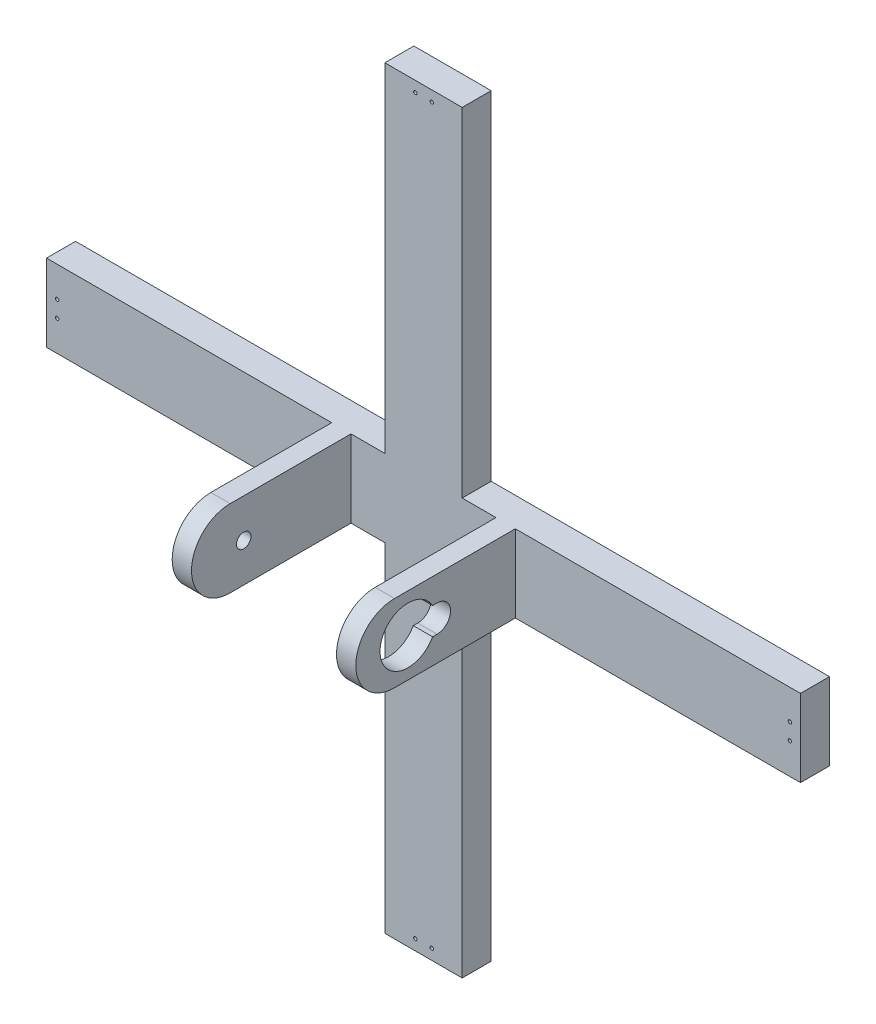
ISO-10303-21;
HEADER;
FILE_DESCRIPTION(('STEP AP214'),'2;1');
FILE_NAME('part.step','',(''),(''),'','','');
FILE_SCHEMA(('AUTOMOTIVE_DESIGN { 1 0 10303 214 1 1 1 1 }'));
ENDSEC;
DATA;
#1=APPLICATION_CONTEXT('core data for automotive mechanical design processes');
#2=APPLICATION_PROTOCOL_DEFINITION('international standard','automotive_design',2000,#1);
#3=PRODUCT_CONTEXT('',#1,'mechanical');
#4=PRODUCT('Part','Part','',(#3));
#5=PRODUCT_RELATED_PRODUCT_CATEGORY('part','',(#4));
#6=PRODUCT_DEFINITION_FORMATION('','',#4);
#7=PRODUCT_DEFINITION_CONTEXT('part definition',#1,'design');
#8=PRODUCT_DEFINITION('design','',#6,#7);
#9=PRODUCT_DEFINITION_SHAPE('','',#8);
#10=(LENGTH_UNIT() NAMED_UNIT(*) SI_UNIT(.MILLI.,.METRE.));
#11=(NAMED_UNIT(*) PLANE_ANGLE_UNIT() SI_UNIT($,.RADIAN.));
#12=(NAMED_UNIT(*) SI_UNIT($,.STERADIAN.) SOLID_ANGLE_UNIT());
#13=UNCERTAINTY_MEASURE_WITH_UNIT(LENGTH_MEASURE(1.E-05),#10,'distance_accuracy_value','');
#14=(GEOMETRIC_REPRESENTATION_CONTEXT(3) GLOBAL_UNCERTAINTY_ASSIGNED_CONTEXT((#13)) GLOBAL_UNIT_ASSIGNED_CONTEXT((#10,
#11,#12)) REPRESENTATION_CONTEXT('',''));
#15=CARTESIAN_POINT('',(0.,0.,0.));
#16=DIRECTION('',(0.,0.,1.));
#17=DIRECTION('',(1.,0.,0.));
#18=AXIS2_PLACEMENT_3D('',#15,#16,#17);
#19=CARTESIAN_POINT('',(15.,0.,36.));
#20=DIRECTION('',(1.,0.,0.));
#21=DIRECTION('',(0.,0.,-1.));
#22=AXIS2_PLACEMENT_3D('',#19,#20,#21);
#23=PLANE('',#22);
#24=DIRECTION('',(0.,0.,-1.));
#25=VECTOR('',#24,1.);
#26=CARTESIAN_POINT('',(15.,-16.,36.));
#27=LINE('',#26,#25);
#28=CARTESIAN_POINT('',(15.,-16.,28.));
#29=VERTEX_POINT('',#28);
#30=CARTESIAN_POINT('',(15.,-16.,3.));
#31=VERTEX_POINT('',#30);
#32=EDGE_CURVE('E254',#29,#31,#27,.T.);
#33=ORIENTED_EDGE('',*,*,#32,.F.);
#34=CARTESIAN_POINT('',(15.,-8.,28.));
#35=DIRECTION('',(1.,0.,0.));
#36=DIRECTION('',(0.,0.,-1.));
#37=AXIS2_PLACEMENT_3D('',#34,#35,#36);
#38=CIRCLE('',#37,8.);
#39=CARTESIAN_POINT('',(15.,0.,28.));
#40=VERTEX_POINT('',#39);
#41=EDGE_CURVE('E385',#29,#40,#38,.F.);
#42=ORIENTED_EDGE('',*,*,#41,.T.);
#43=DIRECTION('',(0.,0.,-1.));
#44=VECTOR('',#43,1.);
#45=CARTESIAN_POINT('',(15.,0.,36.));
#46=LINE('',#45,#44);
#47=CARTESIAN_POINT('',(15.,0.,3.));
#48=VERTEX_POINT('',#47);
#49=EDGE_CURVE('E369',#40,#48,#46,.T.);
#50=ORIENTED_EDGE('',*,*,#49,.T.);
#51=DIRECTION('',(0.,-1.,0.));
#52=VECTOR('',#51,1.);
#53=CARTESIAN_POINT('',(15.,0.,3.));
#54=LINE('',#53,#52);
#55=EDGE_CURVE('E197',#48,#31,#54,.T.);
#56=ORIENTED_EDGE('',*,*,#55,.T.);
#57=EDGE_LOOP('',(#33,#42,#50,#56));
#58=FACE_BOUND('',#57,.T.);
#59=CARTESIAN_POINT('',(15.,-8.,19.2));
#60=DIRECTION('',(1.,0.,0.));
#61=DIRECTION('',(0.,0.,-1.));
#62=AXIS2_PLACEMENT_3D('',#59,#60,#61);
#63=CIRCLE('',#62,2.8);
#64=CARTESIAN_POINT('',(15.,-5.2,19.2));
#65=VERTEX_POINT('',#64);
#66=CARTESIAN_POINT('',(15.,-10.8,19.2));
#67=VERTEX_POINT('',#66);
#68=EDGE_CURVE('E204',#65,#67,#63,.F.);
#69=ORIENTED_EDGE('',*,*,#68,.F.);
#70=DIRECTION('',(0.,0.,-1.));
#71=VECTOR('',#70,1.);
#72=CARTESIAN_POINT('',(15.,-5.2,36.));
#73=LINE('',#72,#71);
#74=CARTESIAN_POINT('',(15.,-5.2,20.1206299603199));
#75=VERTEX_POINT('',#74);
#76=EDGE_CURVE('E403',#75,#65,#73,.T.);
#77=ORIENTED_EDGE('',*,*,#76,.F.);
#78=CARTESIAN_POINT('',(15.,-8.,25.2));
#79=DIRECTION('',(1.,0.,0.));
#80=DIRECTION('',(0.,0.,-1.));
#81=AXIS2_PLACEMENT_3D('',#78,#79,#80);
#82=CIRCLE('',#81,5.8);
#83=CARTESIAN_POINT('',(15.,-10.8,20.1206299603199));
#84=VERTEX_POINT('',#83);
#85=EDGE_CURVE('E405',#84,#75,#82,.F.);
#86=ORIENTED_EDGE('',*,*,#85,.F.);
#87=DIRECTION('',(0.,0.,1.));
#88=VECTOR('',#87,1.);
#89=CARTESIAN_POINT('',(15.,-10.8,36.));
#90=LINE('',#89,#88);
#91=EDGE_CURVE('E407',#67,#84,#90,.T.);
#92=ORIENTED_EDGE('',*,*,#91,.F.);
#93=EDGE_LOOP('',(#69,#77,#86,#92));
#94=FACE_BOUND('',#93,.T.);
#95=ADVANCED_FACE('F33',(#58,#94),#23,.F.);
#96=CARTESIAN_POINT('',(19.,0.,36.));
#97=DIRECTION('',(-1.,0.,0.));
#98=DIRECTION('',(0.,0.,1.));
#99=AXIS2_PLACEMENT_3D('',#96,#97,#98);
#100=PLANE('',#99);
#101=DIRECTION('',(0.,0.,-1.));
#102=VECTOR('',#101,1.);
#103=CARTESIAN_POINT('',(19.,0.,36.));
#104=LINE('',#103,#102);
#105=CARTESIAN_POINT('',(19.,0.,28.));
#106=VERTEX_POINT('',#105);
#107=CARTESIAN_POINT('',(19.,0.,3.));
#108=VERTEX_POINT('',#107);
#109=EDGE_CURVE('E367',#106,#108,#104,.T.);
#110=ORIENTED_EDGE('',*,*,#109,.F.);
#111=CARTESIAN_POINT('',(19.,-8.,28.));
#112=DIRECTION('',(-1.,0.,0.));
#113=DIRECTION('',(0.,0.,1.));
#114=AXIS2_PLACEMENT_3D('',#111,#112,#113);
#115=CIRCLE('',#114,8.);
#116=CARTESIAN_POINT('',(19.,-16.,28.));
#117=VERTEX_POINT('',#116);
#118=EDGE_CURVE('E387',#106,#117,#115,.F.);
#119=ORIENTED_EDGE('',*,*,#118,.T.);
#120=DIRECTION('',(0.,0.,-1.));
#121=VECTOR('',#120,1.);
#122=CARTESIAN_POINT('',(19.,-16.,36.));
#123=LINE('',#122,#121);
#124=CARTESIAN_POINT('',(19.,-16.,3.));
#125=VERTEX_POINT('',#124);
#126=EDGE_CURVE('E365',#117,#125,#123,.T.);
#127=ORIENTED_EDGE('',*,*,#126,.T.);
#128=DIRECTION('',(0.,1.,0.));
#129=VECTOR('',#128,1.);
#130=CARTESIAN_POINT('',(19.,0.,3.));
#131=LINE('',#130,#129);
#132=EDGE_CURVE('E218',#125,#108,#131,.T.);
#133=ORIENTED_EDGE('',*,*,#132,.T.);
#134=EDGE_LOOP('',(#110,#119,#127,#133));
#135=FACE_BOUND('',#134,.T.);
#136=CARTESIAN_POINT('',(19.,-8.,19.2));
#137=DIRECTION('',(-1.,0.,0.));
#138=DIRECTION('',(0.,0.,1.));
#139=AXIS2_PLACEMENT_3D('',#136,#137,#138);
#140=CIRCLE('',#139,2.8);
#141=CARTESIAN_POINT('',(19.,-10.8,19.2));
#142=VERTEX_POINT('',#141);
#143=CARTESIAN_POINT('',(19.,-5.2,19.2));
#144=VERTEX_POINT('',#143);
#145=EDGE_CURVE('E11',#142,#144,#140,.F.);
#146=ORIENTED_EDGE('',*,*,#145,.F.);
#147=DIRECTION('',(0.,0.,-1.));
#148=VECTOR('',#147,1.);
#149=CARTESIAN_POINT('',(19.,-10.8,36.));
#150=LINE('',#149,#148);
#151=CARTESIAN_POINT('',(19.,-10.8,20.1206299603199));
#152=VERTEX_POINT('',#151);
#153=EDGE_CURVE('E191',#152,#142,#150,.T.);
#154=ORIENTED_EDGE('',*,*,#153,.F.);
#155=CARTESIAN_POINT('',(19.,-8.,25.2));
#156=DIRECTION('',(-1.,0.,0.));
#157=DIRECTION('',(0.,0.,1.));
#158=AXIS2_PLACEMENT_3D('',#155,#156,#157);
#159=CIRCLE('',#158,5.8);
#160=CARTESIAN_POINT('',(19.,-5.2,20.1206299603199));
#161=VERTEX_POINT('',#160);
#162=EDGE_CURVE('E196',#161,#152,#159,.F.);
#163=ORIENTED_EDGE('',*,*,#162,.F.);
#164=DIRECTION('',(0.,0.,1.));
#165=VECTOR('',#164,1.);
#166=CARTESIAN_POINT('',(19.,-5.2,36.));
#167=LINE('',#166,#165);
#168=EDGE_CURVE('E42',#144,#161,#167,.T.);
#169=ORIENTED_EDGE('',*,*,#168,.F.);
#170=EDGE_LOOP('',(#146,#154,#163,#169));
#171=FACE_BOUND('',#170,.T.);
#172=ADVANCED_FACE('F209',(#135,#171),#100,.F.);
#173=CARTESIAN_POINT('',(-8.,0.,3.));
#174=DIRECTION('',(0.,-1.,0.));
#175=DIRECTION('',(1.,0.,0.));
#176=AXIS2_PLACEMENT_3D('',#173,#174,#175);
#177=PLANE('',#176);
#178=DIRECTION('',(1.,0.,0.));
#179=VECTOR('',#178,1.);
#180=CARTESIAN_POINT('',(-78.,0.,28.));
#181=LINE('',#180,#179);
#182=CARTESIAN_POINT('',(-19.,0.,28.));
#183=VERTEX_POINT('',#182);
#184=CARTESIAN_POINT('',(-15.,0.,28.));
#185=VERTEX_POINT('',#184);
#186=EDGE_CURVE('E395',#183,#185,#181,.T.);
#187=ORIENTED_EDGE('',*,*,#186,.T.);
#188=DIRECTION('',(0.,0.,-1.));
#189=VECTOR('',#188,1.);
#190=CARTESIAN_POINT('',(-15.,0.,36.));
#191=LINE('',#190,#189);
#192=CARTESIAN_POINT('',(-15.,0.,3.));
#193=VERTEX_POINT('',#192);
#194=EDGE_CURVE('E377',#185,#193,#191,.T.);
#195=ORIENTED_EDGE('',*,*,#194,.T.);
#196=DIRECTION('',(-1.,0.,0.));
#197=VECTOR('',#196,1.);
#198=CARTESIAN_POINT('',(-8.,0.,3.));
#199=LINE('',#198,#197);
#200=CARTESIAN_POINT('',(-8.,0.,3.));
#201=VERTEX_POINT('',#200);
#202=EDGE_CURVE('E342',#201,#193,#199,.T.);
#203=ORIENTED_EDGE('',*,*,#202,.F.);
#204=DIRECTION('',(0.,0.,-1.));
#205=VECTOR('',#204,1.);
#206=CARTESIAN_POINT('',(-8.,0.,3.));
#207=LINE('',#206,#205);
#208=CARTESIAN_POINT('',(-8.,0.,-3.));
#209=VERTEX_POINT('',#208);
#210=EDGE_CURVE('E221',#201,#209,#207,.T.);
#211=ORIENTED_EDGE('',*,*,#210,.T.);
#212=DIRECTION('',(-1.,0.,0.));
#213=VECTOR('',#212,1.);
#214=CARTESIAN_POINT('',(-8.,0.,-3.));
#215=LINE('',#214,#213);
#216=CARTESIAN_POINT('',(-78.,0.,-3.));
#217=VERTEX_POINT('',#216);
#218=EDGE_CURVE('E312',#209,#217,#215,.T.);
#219=ORIENTED_EDGE('',*,*,#218,.T.);
#220=DIRECTION('',(0.,0.,-1.));
#221=VECTOR('',#220,1.);
#222=CARTESIAN_POINT('',(-78.,0.,3.));
#223=LINE('',#222,#221);
#224=CARTESIAN_POINT('',(-78.,0.,3.));
#225=VERTEX_POINT('',#224);
#226=EDGE_CURVE('E257',#225,#217,#223,.T.);
#227=ORIENTED_EDGE('',*,*,#226,.F.);
#228=CARTESIAN_POINT('',(-19.,0.,3.));
#229=VERTEX_POINT('',#228);
#230=EDGE_CURVE('E345',#229,#225,#199,.T.);
#231=ORIENTED_EDGE('',*,*,#230,.F.);
#232=DIRECTION('',(0.,0.,-1.));
#233=VECTOR('',#232,1.);
#234=CARTESIAN_POINT('',(-19.,0.,36.));
#235=LINE('',#234,#233);
#236=EDGE_CURVE('E379',#183,#229,#235,.T.);
#237=ORIENTED_EDGE('',*,*,#236,.F.);
#238=EDGE_LOOP('',(#187,#195,#203,#211,#219,#227,#231,#237));
#239=FACE_BOUND('',#238,.T.);
#240=ADVANCED_FACE('F438',(#239),#177,.F.);
#241=CARTESIAN_POINT('',(8.,0.,3.));
#242=DIRECTION('',(0.,-1.,0.));
#243=DIRECTION('',(1.,0.,0.));
#244=AXIS2_PLACEMENT_3D('',#241,#242,#243);
#245=PLANE('',#244);
#246=EDGE_CURVE('E399',#40,#106,#181,.T.);
#247=ORIENTED_EDGE('',*,*,#246,.T.);
#248=ORIENTED_EDGE('',*,*,#109,.T.);
#249=DIRECTION('',(-1.,0.,0.));
#250=VECTOR('',#249,1.);
#251=CARTESIAN_POINT('',(8.,0.,3.));
#252=LINE('',#251,#250);
#253=CARTESIAN_POINT('',(78.,0.,3.));
#254=VERTEX_POINT('',#253);
#255=EDGE_CURVE('E320',#254,#108,#252,.T.);
#256=ORIENTED_EDGE('',*,*,#255,.F.);
#257=DIRECTION('',(0.,0.,-1.));
#258=VECTOR('',#257,1.);
#259=CARTESIAN_POINT('',(78.,0.,3.));
#260=LINE('',#259,#258);
#261=CARTESIAN_POINT('',(78.,0.,-3.));
#262=VERTEX_POINT('',#261);
#263=EDGE_CURVE('E278',#254,#262,#260,.T.);
#264=ORIENTED_EDGE('',*,*,#263,.T.);
#265=DIRECTION('',(-1.,0.,0.));
#266=VECTOR('',#265,1.);
#267=CARTESIAN_POINT('',(8.,0.,-3.));
#268=LINE('',#267,#266);
#269=CARTESIAN_POINT('',(8.,0.,-3.));
#270=VERTEX_POINT('',#269);
#271=EDGE_CURVE('E296',#262,#270,#268,.T.);
#272=ORIENTED_EDGE('',*,*,#271,.T.);
#273=DIRECTION('',(0.,0.,-1.));
#274=VECTOR('',#273,1.);
#275=CARTESIAN_POINT('',(8.,0.,3.));
#276=LINE('',#275,#274);
#277=CARTESIAN_POINT('',(8.,0.,3.));
#278=VERTEX_POINT('',#277);
#279=EDGE_CURVE('E281',#278,#270,#276,.T.);
#280=ORIENTED_EDGE('',*,*,#279,.F.);
#281=EDGE_CURVE('E323',#48,#278,#252,.T.);
#282=ORIENTED_EDGE('',*,*,#281,.F.);
#283=ORIENTED_EDGE('',*,*,#49,.F.);
#284=EDGE_LOOP('',(#247,#248,#256,#264,#272,#280,#282,#283));
#285=FACE_BOUND('',#284,.T.);
#286=ADVANCED_FACE('F483',(#285),#245,.F.);
#287=CARTESIAN_POINT('',(0.,0.,3.));
#288=DIRECTION('',(0.,0.,-1.));
#289=DIRECTION('',(-1.,0.,0.));
#290=AXIS2_PLACEMENT_3D('',#287,#288,#289);
#291=PLANE('',#290);
#292=CARTESIAN_POINT('',(-1.7,67.8,3.));
#293=DIRECTION('',(0.,0.,-1.));
#294=DIRECTION('',(-1.,0.,0.));
#295=AXIS2_PLACEMENT_3D('',#292,#293,#294);
#296=CIRCLE('',#295,0.350000000000002);
#297=CARTESIAN_POINT('',(-2.05,67.8,3.));
#298=VERTEX_POINT('',#297);
#299=EDGE_CURVE('E230',#298,#298,#296,.T.);
#300=ORIENTED_EDGE('',*,*,#299,.T.);
#301=EDGE_LOOP('',(#300));
#302=FACE_BOUND('',#301,.T.);
#303=CARTESIAN_POINT('',(1.7,67.8,3.));
#304=DIRECTION('',(0.,0.,-1.));
#305=DIRECTION('',(-1.,0.,0.));
#306=AXIS2_PLACEMENT_3D('',#303,#304,#305);
#307=CIRCLE('',#306,0.350000000000002);
#308=CARTESIAN_POINT('',(1.35,67.8,3.));
#309=VERTEX_POINT('',#308);
#310=EDGE_CURVE('E234',#309,#309,#307,.T.);
#311=ORIENTED_EDGE('',*,*,#310,.T.);
#312=EDGE_LOOP('',(#311));
#313=FACE_BOUND('',#312,.T.);
#314=CARTESIAN_POINT('',(1.7,-83.8,3.));
#315=DIRECTION('',(0.,0.,-1.));
#316=DIRECTION('',(-1.,0.,0.));
#317=AXIS2_PLACEMENT_3D('',#314,#315,#316);
#318=CIRCLE('',#317,0.350000000000001);
#319=CARTESIAN_POINT('',(1.35,-83.8,3.));
#320=VERTEX_POINT('',#319);
#321=EDGE_CURVE('E238',#320,#320,#318,.T.);
#322=ORIENTED_EDGE('',*,*,#321,.T.);
#323=EDGE_LOOP('',(#322));
#324=FACE_BOUND('',#323,.T.);
#325=CARTESIAN_POINT('',(-1.7,-83.8,3.));
#326=DIRECTION('',(0.,0.,-1.));
#327=DIRECTION('',(-1.,0.,0.));
#328=AXIS2_PLACEMENT_3D('',#325,#326,#327);
#329=CIRCLE('',#328,0.350000000000003);
#330=CARTESIAN_POINT('',(-2.05,-83.8,3.));
#331=VERTEX_POINT('',#330);
#332=EDGE_CURVE('E242',#331,#331,#329,.T.);
#333=ORIENTED_EDGE('',*,*,#332,.T.);
#334=EDGE_LOOP('',(#333));
#335=FACE_BOUND('',#334,.T.);
#336=DIRECTION('',(0.,1.,0.));
#337=VECTOR('',#336,1.);
#338=CARTESIAN_POINT('',(-15.,0.,3.));
#339=LINE('',#338,#337);
#340=CARTESIAN_POINT('',(-15.,-16.,3.));
#341=VERTEX_POINT('',#340);
#342=EDGE_CURVE('E371',#341,#193,#339,.T.);
#343=ORIENTED_EDGE('',*,*,#342,.F.);
#344=DIRECTION('',(1.,0.,0.));
#345=VECTOR('',#344,1.);
#346=CARTESIAN_POINT('',(-78.,-16.,3.));
#347=LINE('',#346,#345);
#348=CARTESIAN_POINT('',(-8.00000000000001,-16.,3.));
#349=VERTEX_POINT('',#348);
#350=EDGE_CURVE('E339',#341,#349,#347,.T.);
#351=ORIENTED_EDGE('',*,*,#350,.T.);
#352=DIRECTION('',(0.,-1.,0.));
#353=VECTOR('',#352,1.);
#354=CARTESIAN_POINT('',(-8.00000000000001,-16.,3.));
#355=LINE('',#354,#353);
#356=CARTESIAN_POINT('',(-8.,-86.,3.));
#357=VERTEX_POINT('',#356);
#358=EDGE_CURVE('E334',#349,#357,#355,.T.);
#359=ORIENTED_EDGE('',*,*,#358,.T.);
#360=DIRECTION('',(1.,0.,0.));
#361=VECTOR('',#360,1.);
#362=CARTESIAN_POINT('',(-8.,-86.,3.));
#363=LINE('',#362,#361);
#364=CARTESIAN_POINT('',(8.,-86.,3.));
#365=VERTEX_POINT('',#364);
#366=EDGE_CURVE('E332',#357,#365,#363,.T.);
#367=ORIENTED_EDGE('',*,*,#366,.T.);
#368=DIRECTION('',(0.,1.,0.));
#369=VECTOR('',#368,1.);
#370=CARTESIAN_POINT('',(8.00000000000001,-16.,3.));
#371=LINE('',#370,#369);
#372=CARTESIAN_POINT('',(8.00000000000001,-16.,3.));
#373=VERTEX_POINT('',#372);
#374=EDGE_CURVE('E330',#365,#373,#371,.T.);
#375=ORIENTED_EDGE('',*,*,#374,.T.);
#376=DIRECTION('',(1.,0.,0.));
#377=VECTOR('',#376,1.);
#378=CARTESIAN_POINT('',(78.,-16.,3.));
#379=LINE('',#378,#377);
#380=EDGE_CURVE('E326',#373,#31,#379,.T.);
#381=ORIENTED_EDGE('',*,*,#380,.T.);
#382=ORIENTED_EDGE('',*,*,#55,.F.);
#383=ORIENTED_EDGE('',*,*,#281,.T.);
#384=DIRECTION('',(0.,1.,0.));
#385=VECTOR('',#384,1.);
#386=CARTESIAN_POINT('',(8.,70.,3.));
#387=LINE('',#386,#385);
#388=CARTESIAN_POINT('',(8.,70.,3.));
#389=VERTEX_POINT('',#388);
#390=EDGE_CURVE('E318',#278,#389,#387,.T.);
#391=ORIENTED_EDGE('',*,*,#390,.T.);
#392=DIRECTION('',(-1.,0.,0.));
#393=VECTOR('',#392,1.);
#394=CARTESIAN_POINT('',(8.,70.,3.));
#395=LINE('',#394,#393);
#396=CARTESIAN_POINT('',(-8.,70.,3.));
#397=VERTEX_POINT('',#396);
#398=EDGE_CURVE('E290',#389,#397,#395,.T.);
#399=ORIENTED_EDGE('',*,*,#398,.T.);
#400=DIRECTION('',(0.,-1.,0.));
#401=VECTOR('',#400,1.);
#402=CARTESIAN_POINT('',(-8.,70.,3.));
#403=LINE('',#402,#401);
#404=EDGE_CURVE('E293',#397,#201,#403,.T.);
#405=ORIENTED_EDGE('',*,*,#404,.T.);
#406=ORIENTED_EDGE('',*,*,#202,.T.);
#407=EDGE_LOOP('',(#343,#351,#359,#367,#375,#381,#382,#383,#391,#399,#405,#406));
#408=FACE_BOUND('',#407,.T.);
#409=ADVANCED_FACE('F479',(#302,#313,#324,#335,#408),#291,.F.);
#410=CARTESIAN_POINT('',(-75.8,-6.30000000000001,3.));
#411=DIRECTION('',(0.,0.,-1.));
#412=DIRECTION('',(-1.,0.,0.));
#413=AXIS2_PLACEMENT_3D('',#410,#411,#412);
#414=CIRCLE('',#413,0.350000000000008);
#415=CARTESIAN_POINT('',(-76.15,-6.30000000000001,3.));
#416=VERTEX_POINT('',#415);
#417=EDGE_CURVE('E225',#416,#416,#414,.T.);
#418=ORIENTED_EDGE('',*,*,#417,.T.);
#419=EDGE_LOOP('',(#418));
#420=FACE_BOUND('',#419,.T.);
#421=CARTESIAN_POINT('',(-75.8,-9.70000000000001,3.));
#422=DIRECTION('',(0.,0.,-1.));
#423=DIRECTION('',(-1.,0.,0.));
#424=AXIS2_PLACEMENT_3D('',#421,#422,#423);
#425=CIRCLE('',#424,0.350000000000008);
#426=CARTESIAN_POINT('',(-76.15,-9.70000000000001,3.));
#427=VERTEX_POINT('',#426);
#428=EDGE_CURVE('E226',#427,#427,#425,.T.);
#429=ORIENTED_EDGE('',*,*,#428,.T.);
#430=EDGE_LOOP('',(#429));
#431=FACE_BOUND('',#430,.T.);
#432=DIRECTION('',(0.,-1.,0.));
#433=VECTOR('',#432,1.);
#434=CARTESIAN_POINT('',(-19.,0.,3.));
#435=LINE('',#434,#433);
#436=CARTESIAN_POINT('',(-19.,-16.,3.));
#437=VERTEX_POINT('',#436);
#438=EDGE_CURVE('E374',#229,#437,#435,.T.);
#439=ORIENTED_EDGE('',*,*,#438,.F.);
#440=ORIENTED_EDGE('',*,*,#230,.T.);
#441=DIRECTION('',(0.,-1.,0.));
#442=VECTOR('',#441,1.);
#443=CARTESIAN_POINT('',(-78.,0.,3.));
#444=LINE('',#443,#442);
#445=CARTESIAN_POINT('',(-78.,-16.,3.));
#446=VERTEX_POINT('',#445);
#447=EDGE_CURVE('E340',#225,#446,#444,.T.);
#448=ORIENTED_EDGE('',*,*,#447,.T.);
#449=EDGE_CURVE('E336',#446,#437,#347,.T.);
#450=ORIENTED_EDGE('',*,*,#449,.T.);
#451=EDGE_LOOP('',(#439,#440,#448,#450));
#452=FACE_BOUND('',#451,.T.);
#453=ADVANCED_FACE('F482',(#420,#431,#452),#291,.F.);
#454=CARTESIAN_POINT('',(75.8048988348421,-6.1987790498271,3.));
#455=DIRECTION('',(0.,0.,-1.));
#456=DIRECTION('',(-1.,0.,0.));
#457=AXIS2_PLACEMENT_3D('',#454,#455,#456);
#458=CIRCLE('',#457,0.350000000000008);
#459=CARTESIAN_POINT('',(75.4548988348421,-6.1987790498271,3.));
#460=VERTEX_POINT('',#459);
#461=EDGE_CURVE('E250',#460,#460,#458,.T.);
#462=ORIENTED_EDGE('',*,*,#461,.T.);
#463=EDGE_LOOP('',(#462));
#464=FACE_BOUND('',#463,.T.);
#465=CARTESIAN_POINT('',(75.8048988348421,-9.5987790498271,3.));
#466=DIRECTION('',(0.,0.,-1.));
#467=DIRECTION('',(-1.,0.,0.));
#468=AXIS2_PLACEMENT_3D('',#465,#466,#467);
#469=CIRCLE('',#468,0.350000000000008);
#470=CARTESIAN_POINT('',(75.4548988348421,-9.5987790498271,3.));
#471=VERTEX_POINT('',#470);
#472=EDGE_CURVE('E246',#471,#471,#469,.T.);
#473=ORIENTED_EDGE('',*,*,#472,.T.);
#474=EDGE_LOOP('',(#473));
#475=FACE_BOUND('',#474,.T.);
#476=ORIENTED_EDGE('',*,*,#132,.F.);
#477=CARTESIAN_POINT('',(78.,-16.,3.));
#478=VERTEX_POINT('',#477);
#479=EDGE_CURVE('E329',#125,#478,#379,.T.);
#480=ORIENTED_EDGE('',*,*,#479,.T.);
#481=DIRECTION('',(0.,1.,0.));
#482=VECTOR('',#481,1.);
#483=CARTESIAN_POINT('',(78.,0.,3.));
#484=LINE('',#483,#482);
#485=EDGE_CURVE('E324',#478,#254,#484,.T.);
#486=ORIENTED_EDGE('',*,*,#485,.T.);
#487=ORIENTED_EDGE('',*,*,#255,.T.);
#488=EDGE_LOOP('',(#476,#480,#486,#487));
#489=FACE_BOUND('',#488,.T.);
#490=ADVANCED_FACE('F485',(#464,#475,#489),#291,.F.);
#491=CARTESIAN_POINT('',(-8.,70.,3.));
#492=DIRECTION('',(1.,0.,0.));
#493=DIRECTION('',(0.,0.,-1.));
#494=AXIS2_PLACEMENT_3D('',#491,#492,#493);
#495=PLANE('',#494);
#496=DIRECTION('',(0.,-1.,0.));
#497=VECTOR('',#496,1.);
#498=CARTESIAN_POINT('',(-8.,70.,-3.));
#499=LINE('',#498,#497);
#500=CARTESIAN_POINT('',(-8.,70.,-3.));
#501=VERTEX_POINT('',#500);
#502=EDGE_CURVE('E314',#501,#209,#499,.T.);
#503=ORIENTED_EDGE('',*,*,#502,.T.);
#504=ORIENTED_EDGE('',*,*,#210,.F.);
#505=ORIENTED_EDGE('',*,*,#404,.F.);
#506=DIRECTION('',(0.,0.,-1.));
#507=VECTOR('',#506,1.);
#508=CARTESIAN_POINT('',(-8.,70.,3.));
#509=LINE('',#508,#507);
#510=EDGE_CURVE('E287',#397,#501,#509,.T.);
#511=ORIENTED_EDGE('',*,*,#510,.T.);
#512=EDGE_LOOP('',(#503,#504,#505,#511));
#513=FACE_BOUND('',#512,.T.);
#514=ADVANCED_FACE('F35',(#513),#495,.F.);
#515=CARTESIAN_POINT('',(-78.,0.,3.));
#516=DIRECTION('',(1.,0.,0.));
#517=DIRECTION('',(0.,0.,-1.));
#518=AXIS2_PLACEMENT_3D('',#515,#516,#517);
#519=PLANE('',#518);
#520=DIRECTION('',(0.,-1.,0.));
#521=VECTOR('',#520,1.);
#522=CARTESIAN_POINT('',(-78.,0.,-3.));
#523=LINE('',#522,#521);
#524=CARTESIAN_POINT('',(-78.,-16.,-3.));
#525=VERTEX_POINT('',#524);
#526=EDGE_CURVE('E310',#217,#525,#523,.T.);
#527=ORIENTED_EDGE('',*,*,#526,.T.);
#528=DIRECTION('',(0.,0.,-1.));
#529=VECTOR('',#528,1.);
#530=CARTESIAN_POINT('',(-78.,-16.,3.));
#531=LINE('',#530,#529);
#532=EDGE_CURVE('E260',#446,#525,#531,.T.);
#533=ORIENTED_EDGE('',*,*,#532,.F.);
#534=ORIENTED_EDGE('',*,*,#447,.F.);
#535=ORIENTED_EDGE('',*,*,#226,.T.);
#536=EDGE_LOOP('',(#527,#533,#534,#535));
#537=FACE_BOUND('',#536,.T.);
#538=ADVANCED_FACE('F523',(#537),#519,.F.);
#539=CARTESIAN_POINT('',(-78.,-16.,3.));
#540=DIRECTION('',(0.,1.,0.));
#541=DIRECTION('',(0.,0.,1.));
#542=AXIS2_PLACEMENT_3D('',#539,#540,#541);
#543=PLANE('',#542);
#544=DIRECTION('',(0.,0.,-1.));
#545=VECTOR('',#544,1.);
#546=CARTESIAN_POINT('',(-15.,-16.,36.));
#547=LINE('',#546,#545);
#548=CARTESIAN_POINT('',(-15.,-16.,28.));
#549=VERTEX_POINT('',#548);
#550=EDGE_CURVE('E383',#549,#341,#547,.T.);
#551=ORIENTED_EDGE('',*,*,#550,.F.);
#552=DIRECTION('',(1.,0.,0.));
#553=VECTOR('',#552,1.);
#554=CARTESIAN_POINT('',(-78.,-16.,28.));
#555=LINE('',#554,#553);
#556=CARTESIAN_POINT('',(-19.,-16.,28.));
#557=VERTEX_POINT('',#556);
#558=EDGE_CURVE('E398',#557,#549,#555,.T.);
#559=ORIENTED_EDGE('',*,*,#558,.F.);
#560=DIRECTION('',(0.,0.,-1.));
#561=VECTOR('',#560,1.);
#562=CARTESIAN_POINT('',(-19.,-16.,36.));
#563=LINE('',#562,#561);
#564=EDGE_CURVE('E381',#557,#437,#563,.T.);
#565=ORIENTED_EDGE('',*,*,#564,.T.);
#566=ORIENTED_EDGE('',*,*,#449,.F.);
#567=ORIENTED_EDGE('',*,*,#532,.T.);
#568=DIRECTION('',(1.,0.,0.));
#569=VECTOR('',#568,1.);
#570=CARTESIAN_POINT('',(-78.,-16.,-3.));
#571=LINE('',#570,#569);
#572=CARTESIAN_POINT('',(-8.00000000000001,-16.,-3.));
#573=VERTEX_POINT('',#572);
#574=EDGE_CURVE('E308',#525,#573,#571,.T.);
#575=ORIENTED_EDGE('',*,*,#574,.T.);
#576=DIRECTION('',(0.,0.,-1.));
#577=VECTOR('',#576,1.);
#578=CARTESIAN_POINT('',(-8.00000000000001,-16.,3.));
#579=LINE('',#578,#577);
#580=EDGE_CURVE('E263',#349,#573,#579,.T.);
#581=ORIENTED_EDGE('',*,*,#580,.F.);
#582=ORIENTED_EDGE('',*,*,#350,.F.);
#583=EDGE_LOOP('',(#551,#559,#565,#566,#567,#575,#581,#582));
#584=FACE_BOUND('',#583,.T.);
#585=ADVANCED_FACE('F519',(#584),#543,.F.);
#586=CARTESIAN_POINT('',(-8.00000000000001,-16.,3.));
#587=DIRECTION('',(1.,0.,0.));
#588=DIRECTION('',(0.,1.,0.));
#589=AXIS2_PLACEMENT_3D('',#586,#587,#588);
#590=PLANE('',#589);
#591=DIRECTION('',(0.,-1.,0.));
#592=VECTOR('',#591,1.);
#593=CARTESIAN_POINT('',(-8.00000000000001,-16.,-3.));
#594=LINE('',#593,#592);
#595=CARTESIAN_POINT('',(-8.,-86.,-3.));
#596=VERTEX_POINT('',#595);
#597=EDGE_CURVE('E306',#573,#596,#594,.T.);
#598=ORIENTED_EDGE('',*,*,#597,.T.);
#599=DIRECTION('',(0.,0.,-1.));
#600=VECTOR('',#599,1.);
#601=CARTESIAN_POINT('',(-8.,-86.,3.));
#602=LINE('',#601,#600);
#603=EDGE_CURVE('E266',#357,#596,#602,.T.);
#604=ORIENTED_EDGE('',*,*,#603,.F.);
#605=ORIENTED_EDGE('',*,*,#358,.F.);
#606=ORIENTED_EDGE('',*,*,#580,.T.);
#607=EDGE_LOOP('',(#598,#604,#605,#606));
#608=FACE_BOUND('',#607,.T.);
#609=ADVANCED_FACE('F515',(#608),#590,.F.);
#610=CARTESIAN_POINT('',(-8.,-86.,3.));
#611=DIRECTION('',(0.,1.,0.));
#612=DIRECTION('',(0.,0.,1.));
#613=AXIS2_PLACEMENT_3D('',#610,#611,#612);
#614=PLANE('',#613);
#615=DIRECTION('',(1.,0.,0.));
#616=VECTOR('',#615,1.);
#617=CARTESIAN_POINT('',(-8.,-86.,-3.));
#618=LINE('',#617,#616);
#619=CARTESIAN_POINT('',(8.,-86.,-3.));
#620=VERTEX_POINT('',#619);
#621=EDGE_CURVE('E304',#596,#620,#618,.T.);
#622=ORIENTED_EDGE('',*,*,#621,.T.);
#623=DIRECTION('',(0.,0.,-1.));
#624=VECTOR('',#623,1.);
#625=CARTESIAN_POINT('',(8.,-86.,3.));
#626=LINE('',#625,#624);
#627=EDGE_CURVE('E269',#365,#620,#626,.T.);
#628=ORIENTED_EDGE('',*,*,#627,.F.);
#629=ORIENTED_EDGE('',*,*,#366,.F.);
#630=ORIENTED_EDGE('',*,*,#603,.T.);
#631=EDGE_LOOP('',(#622,#628,#629,#630));
#632=FACE_BOUND('',#631,.T.);
#633=ADVANCED_FACE('F511',(#632),#614,.F.);
#634=CARTESIAN_POINT('',(8.00000000000001,-16.,3.));
#635=DIRECTION('',(-1.,0.,0.));
#636=DIRECTION('',(0.,-1.,0.));
#637=AXIS2_PLACEMENT_3D('',#634,#635,#636);
#638=PLANE('',#637);
#639=DIRECTION('',(0.,1.,0.));
#640=VECTOR('',#639,1.);
#641=CARTESIAN_POINT('',(8.00000000000001,-16.,-3.));
#642=LINE('',#641,#640);
#643=CARTESIAN_POINT('',(8.00000000000001,-16.,-3.));
#644=VERTEX_POINT('',#643);
#645=EDGE_CURVE('E302',#620,#644,#642,.T.);
#646=ORIENTED_EDGE('',*,*,#645,.T.);
#647=DIRECTION('',(0.,0.,-1.));
#648=VECTOR('',#647,1.);
#649=CARTESIAN_POINT('',(8.00000000000001,-16.,3.));
#650=LINE('',#649,#648);
#651=EDGE_CURVE('E272',#373,#644,#650,.T.);
#652=ORIENTED_EDGE('',*,*,#651,.F.);
#653=ORIENTED_EDGE('',*,*,#374,.F.);
#654=ORIENTED_EDGE('',*,*,#627,.T.);
#655=EDGE_LOOP('',(#646,#652,#653,#654));
#656=FACE_BOUND('',#655,.T.);
#657=ADVANCED_FACE('F507',(#656),#638,.F.);
#658=CARTESIAN_POINT('',(78.,-16.,3.));
#659=DIRECTION('',(0.,1.,0.));
#660=DIRECTION('',(0.,0.,1.));
#661=AXIS2_PLACEMENT_3D('',#658,#659,#660);
#662=PLANE('',#661);
#663=ORIENTED_EDGE('',*,*,#126,.F.);
#664=EDGE_CURVE('E396',#29,#117,#555,.T.);
#665=ORIENTED_EDGE('',*,*,#664,.F.);
#666=ORIENTED_EDGE('',*,*,#32,.T.);
#667=ORIENTED_EDGE('',*,*,#380,.F.);
#668=ORIENTED_EDGE('',*,*,#651,.T.);
#669=DIRECTION('',(1.,0.,0.));
#670=VECTOR('',#669,1.);
#671=CARTESIAN_POINT('',(78.,-16.,-3.));
#672=LINE('',#671,#670);
#673=CARTESIAN_POINT('',(78.,-16.,-3.));
#674=VERTEX_POINT('',#673);
#675=EDGE_CURVE('E300',#644,#674,#672,.T.);
#676=ORIENTED_EDGE('',*,*,#675,.T.);
#677=DIRECTION('',(0.,0.,-1.));
#678=VECTOR('',#677,1.);
#679=CARTESIAN_POINT('',(78.,-16.,3.));
#680=LINE('',#679,#678);
#681=EDGE_CURVE('E275',#478,#674,#680,.T.);
#682=ORIENTED_EDGE('',*,*,#681,.F.);
#683=ORIENTED_EDGE('',*,*,#479,.F.);
#684=EDGE_LOOP('',(#663,#665,#666,#667,#668,#676,#682,#683));
#685=FACE_BOUND('',#684,.T.);
#686=ADVANCED_FACE('F503',(#685),#662,.F.);
#687=CARTESIAN_POINT('',(78.,0.,3.));
#688=DIRECTION('',(-1.,0.,0.));
#689=DIRECTION('',(0.,0.,1.));
#690=AXIS2_PLACEMENT_3D('',#687,#688,#689);
#691=PLANE('',#690);
#692=DIRECTION('',(0.,1.,0.));
#693=VECTOR('',#692,1.);
#694=CARTESIAN_POINT('',(78.,0.,-3.));
#695=LINE('',#694,#693);
#696=EDGE_CURVE('E298',#674,#262,#695,.T.);
#697=ORIENTED_EDGE('',*,*,#696,.T.);
#698=ORIENTED_EDGE('',*,*,#263,.F.);
#699=ORIENTED_EDGE('',*,*,#485,.F.);
#700=ORIENTED_EDGE('',*,*,#681,.T.);
#701=EDGE_LOOP('',(#697,#698,#699,#700));
#702=FACE_BOUND('',#701,.T.);
#703=ADVANCED_FACE('F496',(#702),#691,.F.);
#704=CARTESIAN_POINT('',(8.,70.,3.));
#705=DIRECTION('',(-1.,0.,0.));
#706=DIRECTION('',(0.,0.,1.));
#707=AXIS2_PLACEMENT_3D('',#704,#705,#706);
#708=PLANE('',#707);
#709=DIRECTION('',(0.,1.,0.));
#710=VECTOR('',#709,1.);
#711=CARTESIAN_POINT('',(8.,70.,-3.));
#712=LINE('',#711,#710);
#713=CARTESIAN_POINT('',(8.,70.,-3.));
#714=VERTEX_POINT('',#713);
#715=EDGE_CURVE('E294',#270,#714,#712,.T.);
#716=ORIENTED_EDGE('',*,*,#715,.T.);
#717=DIRECTION('',(0.,0.,-1.));
#718=VECTOR('',#717,1.);
#719=CARTESIAN_POINT('',(8.,70.,3.));
#720=LINE('',#719,#718);
#721=EDGE_CURVE('E284',#389,#714,#720,.T.);
#722=ORIENTED_EDGE('',*,*,#721,.F.);
#723=ORIENTED_EDGE('',*,*,#390,.F.);
#724=ORIENTED_EDGE('',*,*,#279,.T.);
#725=EDGE_LOOP('',(#716,#722,#723,#724));
#726=FACE_BOUND('',#725,.T.);
#727=ADVANCED_FACE('F492',(#726),#708,.F.);
#728=CARTESIAN_POINT('',(8.,70.,3.));
#729=DIRECTION('',(0.,-1.,0.));
#730=DIRECTION('',(0.,0.,-1.));
#731=AXIS2_PLACEMENT_3D('',#728,#729,#730);
#732=PLANE('',#731);
#733=DIRECTION('',(-1.,0.,0.));
#734=VECTOR('',#733,1.);
#735=CARTESIAN_POINT('',(8.,70.,-3.));
#736=LINE('',#735,#734);
#737=EDGE_CURVE('E291',#714,#501,#736,.T.);
#738=ORIENTED_EDGE('',*,*,#737,.T.);
#739=ORIENTED_EDGE('',*,*,#510,.F.);
#740=ORIENTED_EDGE('',*,*,#398,.F.);
#741=ORIENTED_EDGE('',*,*,#721,.T.);
#742=EDGE_LOOP('',(#738,#739,#740,#741));
#743=FACE_BOUND('',#742,.T.);
#744=ADVANCED_FACE('F488',(#743),#732,.F.);
#745=CARTESIAN_POINT('',(0.,0.,-3.));
#746=DIRECTION('',(0.,0.,-1.));
#747=DIRECTION('',(-1.,0.,0.));
#748=AXIS2_PLACEMENT_3D('',#745,#746,#747);
#749=PLANE('',#748);
#750=CARTESIAN_POINT('',(-75.8,-6.30000000000001,-3.));
#751=DIRECTION('',(0.,0.,-1.));
#752=DIRECTION('',(-1.,0.,0.));
#753=AXIS2_PLACEMENT_3D('',#750,#751,#752);
#754=CIRCLE('',#753,0.350000000000008);
#755=CARTESIAN_POINT('',(-76.15,-6.30000000000001,-3.));
#756=VERTEX_POINT('',#755);
#757=EDGE_CURVE('E222',#756,#756,#754,.T.);
#758=ORIENTED_EDGE('',*,*,#757,.F.);
#759=EDGE_LOOP('',(#758));
#760=FACE_BOUND('',#759,.T.);
#761=CARTESIAN_POINT('',(-75.8,-9.70000000000001,-3.));
#762=DIRECTION('',(0.,0.,-1.));
#763=DIRECTION('',(-1.,0.,0.));
#764=AXIS2_PLACEMENT_3D('',#761,#762,#763);
#765=CIRCLE('',#764,0.350000000000008);
#766=CARTESIAN_POINT('',(-76.15,-9.70000000000001,-3.));
#767=VERTEX_POINT('',#766);
#768=EDGE_CURVE('E227',#767,#767,#765,.T.);
#769=ORIENTED_EDGE('',*,*,#768,.F.);
#770=EDGE_LOOP('',(#769));
#771=FACE_BOUND('',#770,.T.);
#772=CARTESIAN_POINT('',(-1.7,67.8,-3.));
#773=DIRECTION('',(0.,0.,-1.));
#774=DIRECTION('',(-1.,0.,0.));
#775=AXIS2_PLACEMENT_3D('',#772,#773,#774);
#776=CIRCLE('',#775,0.350000000000002);
#777=CARTESIAN_POINT('',(-2.05,67.8,-3.));
#778=VERTEX_POINT('',#777);
#779=EDGE_CURVE('E231',#778,#778,#776,.T.);
#780=ORIENTED_EDGE('',*,*,#779,.F.);
#781=EDGE_LOOP('',(#780));
#782=FACE_BOUND('',#781,.T.);
#783=CARTESIAN_POINT('',(1.7,67.8,-3.));
#784=DIRECTION('',(0.,0.,-1.));
#785=DIRECTION('',(-1.,0.,0.));
#786=AXIS2_PLACEMENT_3D('',#783,#784,#785);
#787=CIRCLE('',#786,0.350000000000002);
#788=CARTESIAN_POINT('',(1.35,67.8,-3.));
#789=VERTEX_POINT('',#788);
#790=EDGE_CURVE('E235',#789,#789,#787,.T.);
#791=ORIENTED_EDGE('',*,*,#790,.F.);
#792=EDGE_LOOP('',(#791));
#793=FACE_BOUND('',#792,.T.);
#794=CARTESIAN_POINT('',(1.7,-83.8,-3.));
#795=DIRECTION('',(0.,0.,-1.));
#796=DIRECTION('',(-1.,0.,0.));
#797=AXIS2_PLACEMENT_3D('',#794,#795,#796);
#798=CIRCLE('',#797,0.350000000000001);
#799=CARTESIAN_POINT('',(1.35,-83.8,-3.));
#800=VERTEX_POINT('',#799);
#801=EDGE_CURVE('E239',#800,#800,#798,.T.);
#802=ORIENTED_EDGE('',*,*,#801,.F.);
#803=EDGE_LOOP('',(#802));
#804=FACE_BOUND('',#803,.T.);
#805=CARTESIAN_POINT('',(-1.7,-83.8,-3.));
#806=DIRECTION('',(0.,0.,-1.));
#807=DIRECTION('',(-1.,0.,0.));
#808=AXIS2_PLACEMENT_3D('',#805,#806,#807);
#809=CIRCLE('',#808,0.350000000000003);
#810=CARTESIAN_POINT('',(-2.05,-83.8,-3.));
#811=VERTEX_POINT('',#810);
#812=EDGE_CURVE('E243',#811,#811,#809,.T.);
#813=ORIENTED_EDGE('',*,*,#812,.F.);
#814=EDGE_LOOP('',(#813));
#815=FACE_BOUND('',#814,.T.);
#816=CARTESIAN_POINT('',(75.8048988348421,-9.5987790498271,-3.));
#817=DIRECTION('',(0.,0.,-1.));
#818=DIRECTION('',(-1.,0.,0.));
#819=AXIS2_PLACEMENT_3D('',#816,#817,#818);
#820=CIRCLE('',#819,0.350000000000008);
#821=CARTESIAN_POINT('',(75.4548988348421,-9.5987790498271,-3.));
#822=VERTEX_POINT('',#821);
#823=EDGE_CURVE('E247',#822,#822,#820,.T.);
#824=ORIENTED_EDGE('',*,*,#823,.F.);
#825=EDGE_LOOP('',(#824));
#826=FACE_BOUND('',#825,.T.);
#827=CARTESIAN_POINT('',(75.8048988348421,-6.1987790498271,-3.));
#828=DIRECTION('',(0.,0.,-1.));
#829=DIRECTION('',(-1.,0.,0.));
#830=AXIS2_PLACEMENT_3D('',#827,#828,#829);
#831=CIRCLE('',#830,0.350000000000008);
#832=CARTESIAN_POINT('',(75.4548988348421,-6.1987790498271,-3.));
#833=VERTEX_POINT('',#832);
#834=EDGE_CURVE('E251',#833,#833,#831,.T.);
#835=ORIENTED_EDGE('',*,*,#834,.F.);
#836=EDGE_LOOP('',(#835));
#837=FACE_BOUND('',#836,.T.);
#838=ORIENTED_EDGE('',*,*,#502,.F.);
#839=ORIENTED_EDGE('',*,*,#737,.F.);
#840=ORIENTED_EDGE('',*,*,#715,.F.);
#841=ORIENTED_EDGE('',*,*,#271,.F.);
#842=ORIENTED_EDGE('',*,*,#696,.F.);
#843=ORIENTED_EDGE('',*,*,#675,.F.);
#844=ORIENTED_EDGE('',*,*,#645,.F.);
#845=ORIENTED_EDGE('',*,*,#621,.F.);
#846=ORIENTED_EDGE('',*,*,#597,.F.);
#847=ORIENTED_EDGE('',*,*,#574,.F.);
#848=ORIENTED_EDGE('',*,*,#526,.F.);
#849=ORIENTED_EDGE('',*,*,#218,.F.);
#850=EDGE_LOOP('',(#838,#839,#840,#841,#842,#843,#844,#845,#846,#847,#848,#849));
#851=FACE_BOUND('',#850,.T.);
#852=ADVANCED_FACE('F477',(#760,#771,#782,#793,#804,#815,#826,#837,#851),#749,.T.);
#853=CARTESIAN_POINT('',(75.8048988348421,-6.1987790498271,-5.));
#854=DIRECTION('',(0.,0.,1.));
#855=DIRECTION('',(1.,0.,0.));
#856=AXIS2_PLACEMENT_3D('',#853,#854,#855);
#857=CYLINDRICAL_SURFACE('',#856,0.350000000000008);
#858=ORIENTED_EDGE('',*,*,#834,.T.);
#859=EDGE_LOOP('',(#858));
#860=FACE_BOUND('',#859,.T.);
#861=ORIENTED_EDGE('',*,*,#461,.F.);
#862=EDGE_LOOP('',(#861));
#863=FACE_BOUND('',#862,.T.);
#864=ADVANCED_FACE('F454',(#860,#863),#857,.F.);
#865=CARTESIAN_POINT('',(75.8048988348421,-9.5987790498271,-5.));
#866=DIRECTION('',(0.,0.,1.));
#867=DIRECTION('',(1.,0.,0.));
#868=AXIS2_PLACEMENT_3D('',#865,#866,#867);
#869=CYLINDRICAL_SURFACE('',#868,0.350000000000008);
#870=ORIENTED_EDGE('',*,*,#823,.T.);
#871=EDGE_LOOP('',(#870));
#872=FACE_BOUND('',#871,.T.);
#873=ORIENTED_EDGE('',*,*,#472,.F.);
#874=EDGE_LOOP('',(#873));
#875=FACE_BOUND('',#874,.T.);
#876=ADVANCED_FACE('F451',(#872,#875),#869,.F.);
#877=CARTESIAN_POINT('',(-1.7,-83.8,-5.));
#878=DIRECTION('',(0.,0.,1.));
#879=DIRECTION('',(1.,0.,0.));
#880=AXIS2_PLACEMENT_3D('',#877,#878,#879);
#881=CYLINDRICAL_SURFACE('',#880,0.350000000000003);
#882=ORIENTED_EDGE('',*,*,#812,.T.);
#883=EDGE_LOOP('',(#882));
#884=FACE_BOUND('',#883,.T.);
#885=ORIENTED_EDGE('',*,*,#332,.F.);
#886=EDGE_LOOP('',(#885));
#887=FACE_BOUND('',#886,.T.);
#888=ADVANCED_FACE('F449',(#884,#887),#881,.F.);
#889=CARTESIAN_POINT('',(1.7,-83.8,-5.));
#890=DIRECTION('',(0.,0.,1.));
#891=DIRECTION('',(1.,0.,0.));
#892=AXIS2_PLACEMENT_3D('',#889,#890,#891);
#893=CYLINDRICAL_SURFACE('',#892,0.350000000000001);
#894=ORIENTED_EDGE('',*,*,#801,.T.);
#895=EDGE_LOOP('',(#894));
#896=FACE_BOUND('',#895,.T.);
#897=ORIENTED_EDGE('',*,*,#321,.F.);
#898=EDGE_LOOP('',(#897));
#899=FACE_BOUND('',#898,.T.);
#900=ADVANCED_FACE('F445',(#896,#899),#893,.F.);
#901=CARTESIAN_POINT('',(1.7,67.8,-5.));
#902=DIRECTION('',(0.,0.,1.));
#903=DIRECTION('',(1.,0.,0.));
#904=AXIS2_PLACEMENT_3D('',#901,#902,#903);
#905=CYLINDRICAL_SURFACE('',#904,0.350000000000002);
#906=ORIENTED_EDGE('',*,*,#790,.T.);
#907=EDGE_LOOP('',(#906));
#908=FACE_BOUND('',#907,.T.);
#909=ORIENTED_EDGE('',*,*,#310,.F.);
#910=EDGE_LOOP('',(#909));
#911=FACE_BOUND('',#910,.T.);
#912=ADVANCED_FACE('F448',(#908,#911),#905,.F.);
#913=CARTESIAN_POINT('',(-1.7,67.8,-5.));
#914=DIRECTION('',(0.,0.,1.));
#915=DIRECTION('',(1.,0.,0.));
#916=AXIS2_PLACEMENT_3D('',#913,#914,#915);
#917=CYLINDRICAL_SURFACE('',#916,0.350000000000002);
#918=ORIENTED_EDGE('',*,*,#779,.T.);
#919=EDGE_LOOP('',(#918));
#920=FACE_BOUND('',#919,.T.);
#921=ORIENTED_EDGE('',*,*,#299,.F.);
#922=EDGE_LOOP('',(#921));
#923=FACE_BOUND('',#922,.T.);
#924=ADVANCED_FACE('F467',(#920,#923),#917,.F.);
#925=CARTESIAN_POINT('',(-75.8,-9.70000000000001,-5.));
#926=DIRECTION('',(0.,0.,1.));
#927=DIRECTION('',(1.,0.,0.));
#928=AXIS2_PLACEMENT_3D('',#925,#926,#927);
#929=CYLINDRICAL_SURFACE('',#928,0.350000000000008);
#930=ORIENTED_EDGE('',*,*,#768,.T.);
#931=EDGE_LOOP('',(#930));
#932=FACE_BOUND('',#931,.T.);
#933=ORIENTED_EDGE('',*,*,#428,.F.);
#934=EDGE_LOOP('',(#933));
#935=FACE_BOUND('',#934,.T.);
#936=ADVANCED_FACE('F463',(#932,#935),#929,.F.);
#937=CARTESIAN_POINT('',(-75.8,-6.30000000000001,-5.));
#938=DIRECTION('',(0.,0.,1.));
#939=DIRECTION('',(1.,0.,0.));
#940=AXIS2_PLACEMENT_3D('',#937,#938,#939);
#941=CYLINDRICAL_SURFACE('',#940,0.350000000000008);
#942=ORIENTED_EDGE('',*,*,#757,.T.);
#943=EDGE_LOOP('',(#942));
#944=FACE_BOUND('',#943,.T.);
#945=ORIENTED_EDGE('',*,*,#417,.F.);
#946=EDGE_LOOP('',(#945));
#947=FACE_BOUND('',#946,.T.);
#948=ADVANCED_FACE('F459',(#944,#947),#941,.F.);
#949=CARTESIAN_POINT('',(-15.,0.,36.));
#950=DIRECTION('',(-1.,0.,0.));
#951=DIRECTION('',(0.,0.,1.));
#952=AXIS2_PLACEMENT_3D('',#949,#950,#951);
#953=PLANE('',#952);
#954=CARTESIAN_POINT('',(-15.,-8.,25.2));
#955=DIRECTION('',(-1.,0.,0.));
#956=DIRECTION('',(0.,0.,1.));
#957=AXIS2_PLACEMENT_3D('',#954,#955,#956);
#958=CIRCLE('',#957,1.5);
#959=CARTESIAN_POINT('',(-15.,-8.,26.7));
#960=VERTEX_POINT('',#959);
#961=EDGE_CURVE('E206',#960,#960,#958,.T.);
#962=ORIENTED_EDGE('',*,*,#961,.T.);
#963=EDGE_LOOP('',(#962));
#964=FACE_BOUND('',#963,.T.);
#965=ORIENTED_EDGE('',*,*,#194,.F.);
#966=CARTESIAN_POINT('',(-15.,-8.,28.));
#967=DIRECTION('',(-1.,0.,0.));
#968=DIRECTION('',(0.,0.,1.));
#969=AXIS2_PLACEMENT_3D('',#966,#967,#968);
#970=CIRCLE('',#969,8.);
#971=EDGE_CURVE('E390',#185,#549,#970,.F.);
#972=ORIENTED_EDGE('',*,*,#971,.T.);
#973=ORIENTED_EDGE('',*,*,#550,.T.);
#974=ORIENTED_EDGE('',*,*,#342,.T.);
#975=EDGE_LOOP('',(#965,#972,#973,#974));
#976=FACE_BOUND('',#975,.T.);
#977=ADVANCED_FACE('F462',(#964,#976),#953,.F.);
#978=CARTESIAN_POINT('',(-19.,0.,36.));
#979=DIRECTION('',(1.,0.,0.));
#980=DIRECTION('',(0.,0.,-1.));
#981=AXIS2_PLACEMENT_3D('',#978,#979,#980);
#982=PLANE('',#981);
#983=CARTESIAN_POINT('',(-19.,-8.,25.2));
#984=DIRECTION('',(1.,0.,0.));
#985=DIRECTION('',(0.,0.,-1.));
#986=AXIS2_PLACEMENT_3D('',#983,#984,#985);
#987=CIRCLE('',#986,1.5);
#988=CARTESIAN_POINT('',(-19.,-8.,23.7));
#989=VERTEX_POINT('',#988);
#990=EDGE_CURVE('E37',#989,#989,#987,.T.);
#991=ORIENTED_EDGE('',*,*,#990,.T.);
#992=EDGE_LOOP('',(#991));
#993=FACE_BOUND('',#992,.T.);
#994=ORIENTED_EDGE('',*,*,#564,.F.);
#995=CARTESIAN_POINT('',(-19.,-8.,28.));
#996=DIRECTION('',(1.,0.,0.));
#997=DIRECTION('',(0.,0.,-1.));
#998=AXIS2_PLACEMENT_3D('',#995,#996,#997);
#999=CIRCLE('',#998,8.);
#1000=EDGE_CURVE('E393',#557,#183,#999,.F.);
#1001=ORIENTED_EDGE('',*,*,#1000,.T.);
#1002=ORIENTED_EDGE('',*,*,#236,.T.);
#1003=ORIENTED_EDGE('',*,*,#438,.T.);
#1004=EDGE_LOOP('',(#994,#1001,#1002,#1003));
#1005=FACE_BOUND('',#1004,.T.);
#1006=ADVANCED_FACE('F420',(#993,#1005),#982,.F.);
#1007=CARTESIAN_POINT('',(-78.,-8.,28.));
#1008=DIRECTION('',(1.,0.,0.));
#1009=DIRECTION('',(0.,0.,-1.));
#1010=AXIS2_PLACEMENT_3D('',#1007,#1008,#1009);
#1011=CYLINDRICAL_SURFACE('',#1010,8.);
#1012=ORIENTED_EDGE('',*,*,#971,.F.);
#1013=ORIENTED_EDGE('',*,*,#186,.F.);
#1014=ORIENTED_EDGE('',*,*,#1000,.F.);
#1015=ORIENTED_EDGE('',*,*,#558,.T.);
#1016=EDGE_LOOP('',(#1012,#1013,#1014,#1015));
#1017=FACE_BOUND('',#1016,.T.);
#1018=ADVANCED_FACE('F562',(#1017),#1011,.T.);
#1019=ORIENTED_EDGE('',*,*,#664,.T.);
#1020=ORIENTED_EDGE('',*,*,#118,.F.);
#1021=ORIENTED_EDGE('',*,*,#246,.F.);
#1022=ORIENTED_EDGE('',*,*,#41,.F.);
#1023=EDGE_LOOP('',(#1019,#1020,#1021,#1022));
#1024=FACE_BOUND('',#1023,.T.);
#1025=ADVANCED_FACE('F594',(#1024),#1011,.T.);
#1026=CARTESIAN_POINT('',(100.,-8.,19.2));
#1027=DIRECTION('',(-1.,0.,0.));
#1028=DIRECTION('',(0.,0.,1.));
#1029=AXIS2_PLACEMENT_3D('',#1026,#1027,#1028);
#1030=CYLINDRICAL_SURFACE('',#1029,2.8);
#1031=ORIENTED_EDGE('',*,*,#68,.T.);
#1032=DIRECTION('',(-1.,0.,0.));
#1033=VECTOR('',#1032,1.);
#1034=CARTESIAN_POINT('',(100.,-10.8,19.2));
#1035=LINE('',#1034,#1033);
#1036=EDGE_CURVE('E49',#142,#67,#1035,.T.);
#1037=ORIENTED_EDGE('',*,*,#1036,.F.);
#1038=ORIENTED_EDGE('',*,*,#145,.T.);
#1039=DIRECTION('',(-1.,0.,0.));
#1040=VECTOR('',#1039,1.);
#1041=CARTESIAN_POINT('',(100.,-5.2,19.2));
#1042=LINE('',#1041,#1040);
#1043=EDGE_CURVE('E409',#144,#65,#1042,.T.);
#1044=ORIENTED_EDGE('',*,*,#1043,.T.);
#1045=EDGE_LOOP('',(#1031,#1037,#1038,#1044));
#1046=FACE_BOUND('',#1045,.T.);
#1047=ADVANCED_FACE('F200',(#1046),#1030,.F.);
#1048=CARTESIAN_POINT('',(100.,-5.2,19.2));
#1049=DIRECTION('',(0.,-1.,0.));
#1050=DIRECTION('',(0.,0.,-1.));
#1051=AXIS2_PLACEMENT_3D('',#1048,#1049,#1050);
#1052=PLANE('',#1051);
#1053=ORIENTED_EDGE('',*,*,#76,.T.);
#1054=ORIENTED_EDGE('',*,*,#1043,.F.);
#1055=ORIENTED_EDGE('',*,*,#168,.T.);
#1056=DIRECTION('',(-1.,0.,0.));
#1057=VECTOR('',#1056,1.);
#1058=CARTESIAN_POINT('',(100.,-5.2,20.1206299603199));
#1059=LINE('',#1058,#1057);
#1060=EDGE_CURVE('E411',#161,#75,#1059,.T.);
#1061=ORIENTED_EDGE('',*,*,#1060,.T.);
#1062=EDGE_LOOP('',(#1053,#1054,#1055,#1061));
#1063=FACE_BOUND('',#1062,.T.);
#1064=ADVANCED_FACE('F601',(#1063),#1052,.T.);
#1065=CARTESIAN_POINT('',(100.,-8.,25.2));
#1066=DIRECTION('',(-1.,0.,0.));
#1067=DIRECTION('',(0.,0.,1.));
#1068=AXIS2_PLACEMENT_3D('',#1065,#1066,#1067);
#1069=CYLINDRICAL_SURFACE('',#1068,5.8);
#1070=ORIENTED_EDGE('',*,*,#85,.T.);
#1071=ORIENTED_EDGE('',*,*,#1060,.F.);
#1072=ORIENTED_EDGE('',*,*,#162,.T.);
#1073=DIRECTION('',(-1.,0.,0.));
#1074=VECTOR('',#1073,1.);
#1075=CARTESIAN_POINT('',(100.,-10.8,20.1206299603199));
#1076=LINE('',#1075,#1074);
#1077=EDGE_CURVE('E54',#152,#84,#1076,.T.);
#1078=ORIENTED_EDGE('',*,*,#1077,.T.);
#1079=EDGE_LOOP('',(#1070,#1071,#1072,#1078));
#1080=FACE_BOUND('',#1079,.T.);
#1081=ADVANCED_FACE('F430',(#1080),#1069,.F.);
#1082=CARTESIAN_POINT('',(100.,-10.8,19.2));
#1083=DIRECTION('',(0.,1.,0.));
#1084=DIRECTION('',(0.,0.,1.));
#1085=AXIS2_PLACEMENT_3D('',#1082,#1083,#1084);
#1086=PLANE('',#1085);
#1087=ORIENTED_EDGE('',*,*,#91,.T.);
#1088=ORIENTED_EDGE('',*,*,#1077,.F.);
#1089=ORIENTED_EDGE('',*,*,#153,.T.);
#1090=ORIENTED_EDGE('',*,*,#1036,.T.);
#1091=EDGE_LOOP('',(#1087,#1088,#1089,#1090));
#1092=FACE_BOUND('',#1091,.T.);
#1093=ADVANCED_FACE('F192',(#1092),#1086,.T.);
#1094=CARTESIAN_POINT('',(-39.5,-8.,25.2));
#1095=DIRECTION('',(1.,0.,0.));
#1096=DIRECTION('',(0.,0.,-1.));
#1097=AXIS2_PLACEMENT_3D('',#1094,#1095,#1096);
#1098=CYLINDRICAL_SURFACE('',#1097,1.5);
#1099=ORIENTED_EDGE('',*,*,#990,.F.);
#1100=EDGE_LOOP('',(#1099));
#1101=FACE_BOUND('',#1100,.T.);
#1102=ORIENTED_EDGE('',*,*,#961,.F.);
#1103=EDGE_LOOP('',(#1102));
#1104=FACE_BOUND('',#1103,.T.);
#1105=ADVANCED_FACE('F423',(#1101,#1104),#1098,.F.);
#1106=CLOSED_SHELL('',(#95,#172,#240,#286,#409,#453,#490,#514,#538,#585,#609,#633,#657,#686,
#703,#727,#744,#852,#864,#876,#888,#900,#912,#924,#936,#948,#977,#1006,#1018,#1025,#1047,#1064,
#1081,#1093,#1105));
#1107=MANIFOLD_SOLID_BREP('B2',#1106);
#1108=ADVANCED_BREP_SHAPE_REPRESENTATION('',(#18,#1107),#14);
#1109=SHAPE_DEFINITION_REPRESENTATION(#9,#1108);
ENDSEC;
END-ISO-10303-21;
